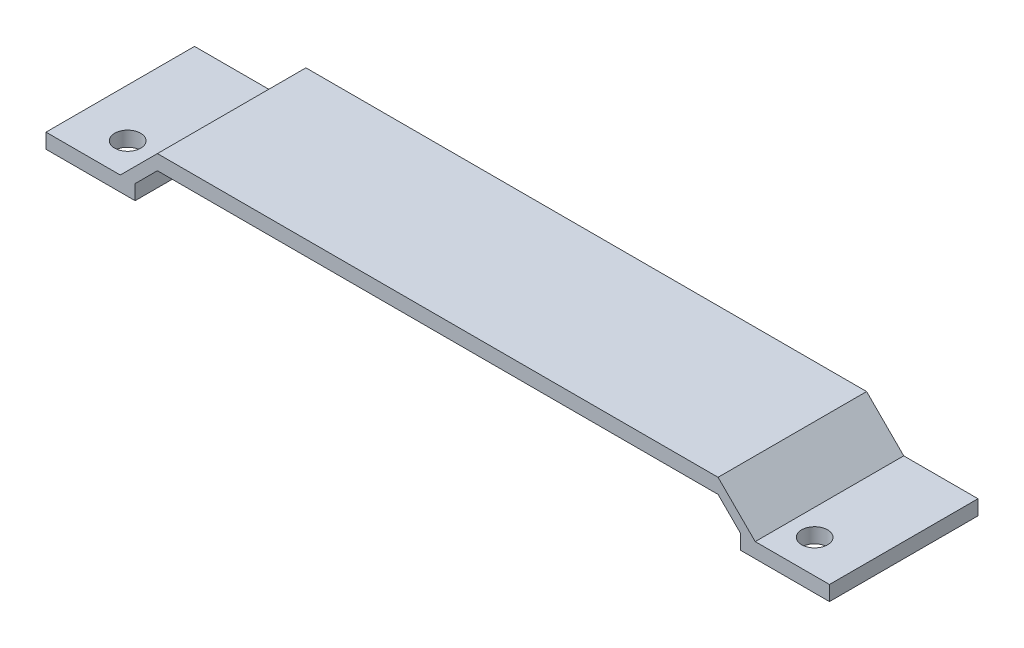
ISO-10303-21;
HEADER;
FILE_DESCRIPTION(('STEP AP214'),'2;1');
FILE_NAME('part.step','',(''),(''),'','','');
FILE_SCHEMA(('AUTOMOTIVE_DESIGN { 1 0 10303 214 1 1 1 1 }'));
ENDSEC;
DATA;
#1=APPLICATION_CONTEXT('core data for automotive mechanical design processes');
#2=APPLICATION_PROTOCOL_DEFINITION('international standard','automotive_design',2000,#1);
#3=PRODUCT_CONTEXT('',#1,'mechanical');
#4=PRODUCT('Part','Part','',(#3));
#5=PRODUCT_RELATED_PRODUCT_CATEGORY('part','',(#4));
#6=PRODUCT_DEFINITION_FORMATION('','',#4);
#7=PRODUCT_DEFINITION_CONTEXT('part definition',#1,'design');
#8=PRODUCT_DEFINITION('design','',#6,#7);
#9=PRODUCT_DEFINITION_SHAPE('','',#8);
#10=(LENGTH_UNIT() NAMED_UNIT(*) SI_UNIT(.MILLI.,.METRE.));
#11=(NAMED_UNIT(*) PLANE_ANGLE_UNIT() SI_UNIT($,.RADIAN.));
#12=(NAMED_UNIT(*) SI_UNIT($,.STERADIAN.) SOLID_ANGLE_UNIT());
#13=UNCERTAINTY_MEASURE_WITH_UNIT(LENGTH_MEASURE(1.E-05),#10,'distance_accuracy_value','');
#14=(GEOMETRIC_REPRESENTATION_CONTEXT(3) GLOBAL_UNCERTAINTY_ASSIGNED_CONTEXT((#13)) GLOBAL_UNIT_ASSIGNED_CONTEXT((#10,
#11,#12)) REPRESENTATION_CONTEXT('',''));
#15=CARTESIAN_POINT('',(0.,0.,0.));
#16=DIRECTION('',(0.,0.,1.));
#17=DIRECTION('',(1.,0.,0.));
#18=AXIS2_PLACEMENT_3D('',#15,#16,#17);
#19=CARTESIAN_POINT('',(0.,-5.00000000000003,20.));
#20=DIRECTION('',(0.,-1.,0.));
#21=DIRECTION('',(1.,0.,0.));
#22=AXIS2_PLACEMENT_3D('',#19,#20,#21);
#23=PLANE('',#22);
#24=CARTESIAN_POINT('',(-46.25,-5.00000000000001,15.5));
#25=DIRECTION('',(0.,1.,0.));
#26=DIRECTION('',(0.,0.,1.));
#27=AXIS2_PLACEMENT_3D('',#24,#25,#26);
#28=CIRCLE('',#27,1.75);
#29=CARTESIAN_POINT('',(-46.25,-5.00000000000001,17.25));
#30=VERTEX_POINT('',#29);
#31=EDGE_CURVE('E262',#30,#30,#28,.T.);
#32=ORIENTED_EDGE('',*,*,#31,.T.);
#33=EDGE_LOOP('',(#32));
#34=FACE_BOUND('',#33,.T.);
#35=DIRECTION('',(-1.,0.,0.));
#36=VECTOR('',#35,1.);
#37=CARTESIAN_POINT('',(0.,-5.00000000000003,0.));
#38=LINE('',#37,#36);
#39=CARTESIAN_POINT('',(-40.75,-5.00000000000001,0.));
#40=VERTEX_POINT('',#39);
#41=CARTESIAN_POINT('',(-52.75,-5.00000000000001,0.));
#42=VERTEX_POINT('',#41);
#43=EDGE_CURVE('E177',#40,#42,#38,.T.);
#44=ORIENTED_EDGE('',*,*,#43,.F.);
#45=DIRECTION('',(0.,0.,-1.));
#46=VECTOR('',#45,1.);
#47=CARTESIAN_POINT('',(-40.75,-5.00000000000001,20.));
#48=LINE('',#47,#46);
#49=CARTESIAN_POINT('',(-40.75,-5.00000000000001,20.));
#50=VERTEX_POINT('',#49);
#51=EDGE_CURVE('E11',#50,#40,#48,.T.);
#52=ORIENTED_EDGE('',*,*,#51,.F.);
#53=DIRECTION('',(-1.,0.,0.));
#54=VECTOR('',#53,1.);
#55=CARTESIAN_POINT('',(0.,-5.00000000000003,20.));
#56=LINE('',#55,#54);
#57=CARTESIAN_POINT('',(-52.75,-5.00000000000001,20.));
#58=VERTEX_POINT('',#57);
#59=EDGE_CURVE('E226',#50,#58,#56,.T.);
#60=ORIENTED_EDGE('',*,*,#59,.T.);
#61=DIRECTION('',(0.,0.,-1.));
#62=VECTOR('',#61,1.);
#63=CARTESIAN_POINT('',(-52.75,-5.00000000000001,20.));
#64=LINE('',#63,#62);
#65=EDGE_CURVE('E113',#58,#42,#64,.T.);
#66=ORIENTED_EDGE('',*,*,#65,.T.);
#67=EDGE_LOOP('',(#44,#52,#60,#66));
#68=FACE_BOUND('',#67,.T.);
#69=ADVANCED_FACE('F41',(#34,#68),#23,.T.);
#70=CARTESIAN_POINT('',(-40.75,0.,20.));
#71=DIRECTION('',(1.,0.,0.));
#72=DIRECTION('',(0.,0.,-1.));
#73=AXIS2_PLACEMENT_3D('',#70,#71,#72);
#74=PLANE('',#73);
#75=DIRECTION('',(0.,-1.,0.));
#76=VECTOR('',#75,1.);
#77=CARTESIAN_POINT('',(-40.75,0.,0.));
#78=LINE('',#77,#76);
#79=CARTESIAN_POINT('',(-40.75,-3.00000000000002,0.));
#80=VERTEX_POINT('',#79);
#81=EDGE_CURVE('E181',#80,#40,#78,.T.);
#82=ORIENTED_EDGE('',*,*,#81,.F.);
#83=DIRECTION('',(0.,0.,-1.));
#84=VECTOR('',#83,1.);
#85=CARTESIAN_POINT('',(-40.75,-3.00000000000002,20.));
#86=LINE('',#85,#84);
#87=CARTESIAN_POINT('',(-40.75,-3.00000000000002,20.));
#88=VERTEX_POINT('',#87);
#89=EDGE_CURVE('E51',#88,#80,#86,.T.);
#90=ORIENTED_EDGE('',*,*,#89,.F.);
#91=DIRECTION('',(0.,-1.,0.));
#92=VECTOR('',#91,1.);
#93=CARTESIAN_POINT('',(-40.75,0.,20.));
#94=LINE('',#93,#92);
#95=EDGE_CURVE('E279',#88,#50,#94,.T.);
#96=ORIENTED_EDGE('',*,*,#95,.T.);
#97=ORIENTED_EDGE('',*,*,#51,.T.);
#98=EDGE_LOOP('',(#82,#90,#96,#97));
#99=FACE_BOUND('',#98,.T.);
#100=ADVANCED_FACE('F335',(#99),#74,.T.);
#101=CARTESIAN_POINT('',(-18.8750000000002,18.875,20.));
#102=DIRECTION('',(-0.707106781186551,0.707106781186544,0.));
#103=DIRECTION('',(-0.707106781186544,-0.707106781186551,0.));
#104=AXIS2_PLACEMENT_3D('',#101,#102,#103);
#105=PLANE('',#104);
#106=DIRECTION('',(0.707106781186544,0.707106781186551,0.));
#107=VECTOR('',#106,1.);
#108=CARTESIAN_POINT('',(-18.8750000000002,18.875,0.));
#109=LINE('',#108,#107);
#110=CARTESIAN_POINT('',(-37.75,0.,0.));
#111=VERTEX_POINT('',#110);
#112=EDGE_CURVE('E185',#80,#111,#109,.T.);
#113=ORIENTED_EDGE('',*,*,#112,.T.);
#114=DIRECTION('',(0.,0.,-1.));
#115=VECTOR('',#114,1.);
#116=CARTESIAN_POINT('',(-37.75,0.,20.));
#117=LINE('',#116,#115);
#118=CARTESIAN_POINT('',(-37.75,0.,20.));
#119=VERTEX_POINT('',#118);
#120=EDGE_CURVE('E255',#119,#111,#117,.T.);
#121=ORIENTED_EDGE('',*,*,#120,.F.);
#122=DIRECTION('',(0.707106781186544,0.707106781186551,0.));
#123=VECTOR('',#122,1.);
#124=CARTESIAN_POINT('',(-18.8750000000002,18.875,20.));
#125=LINE('',#124,#123);
#126=EDGE_CURVE('E283',#88,#119,#125,.T.);
#127=ORIENTED_EDGE('',*,*,#126,.F.);
#128=ORIENTED_EDGE('',*,*,#89,.T.);
#129=EDGE_LOOP('',(#113,#121,#127,#128));
#130=FACE_BOUND('',#129,.T.);
#131=ADVANCED_FACE('F339',(#130),#105,.F.);
#132=CARTESIAN_POINT('',(0.,0.,20.));
#133=DIRECTION('',(0.,-1.,0.));
#134=DIRECTION('',(1.,0.,0.));
#135=AXIS2_PLACEMENT_3D('',#132,#133,#134);
#136=PLANE('',#135);
#137=DIRECTION('',(-1.,0.,0.));
#138=VECTOR('',#137,1.);
#139=CARTESIAN_POINT('',(0.,0.,0.));
#140=LINE('',#139,#138);
#141=CARTESIAN_POINT('',(37.75,0.,0.));
#142=VERTEX_POINT('',#141);
#143=EDGE_CURVE('E189',#142,#111,#140,.T.);
#144=ORIENTED_EDGE('',*,*,#143,.F.);
#145=DIRECTION('',(0.,0.,-1.));
#146=VECTOR('',#145,1.);
#147=CARTESIAN_POINT('',(37.75,0.,20.));
#148=LINE('',#147,#146);
#149=CARTESIAN_POINT('',(37.75,0.,20.));
#150=VERTEX_POINT('',#149);
#151=EDGE_CURVE('E252',#150,#142,#148,.T.);
#152=ORIENTED_EDGE('',*,*,#151,.F.);
#153=DIRECTION('',(-1.,0.,0.));
#154=VECTOR('',#153,1.);
#155=CARTESIAN_POINT('',(0.,0.,20.));
#156=LINE('',#155,#154);
#157=EDGE_CURVE('E286',#150,#119,#156,.T.);
#158=ORIENTED_EDGE('',*,*,#157,.T.);
#159=ORIENTED_EDGE('',*,*,#120,.T.);
#160=EDGE_LOOP('',(#144,#152,#158,#159));
#161=FACE_BOUND('',#160,.T.);
#162=ADVANCED_FACE('F352',(#161),#136,.T.);
#163=CARTESIAN_POINT('',(18.8750000000003,18.875,20.));
#164=DIRECTION('',(-0.707106781186552,-0.707106781186543,0.));
#165=DIRECTION('',(0.707106781186543,-0.707106781186552,0.));
#166=AXIS2_PLACEMENT_3D('',#163,#164,#165);
#167=PLANE('',#166);
#168=DIRECTION('',(-0.707106781186543,0.707106781186552,0.));
#169=VECTOR('',#168,1.);
#170=CARTESIAN_POINT('',(18.8750000000003,18.875,0.));
#171=LINE('',#170,#169);
#172=CARTESIAN_POINT('',(40.75,-3.00000000000001,0.));
#173=VERTEX_POINT('',#172);
#174=EDGE_CURVE('E193',#173,#142,#171,.T.);
#175=ORIENTED_EDGE('',*,*,#174,.F.);
#176=DIRECTION('',(0.,0.,-1.));
#177=VECTOR('',#176,1.);
#178=CARTESIAN_POINT('',(40.75,-3.00000000000001,20.));
#179=LINE('',#178,#177);
#180=CARTESIAN_POINT('',(40.75,-3.00000000000001,20.));
#181=VERTEX_POINT('',#180);
#182=EDGE_CURVE('E249',#181,#173,#179,.T.);
#183=ORIENTED_EDGE('',*,*,#182,.F.);
#184=DIRECTION('',(-0.707106781186543,0.707106781186552,0.));
#185=VECTOR('',#184,1.);
#186=CARTESIAN_POINT('',(18.8750000000003,18.875,20.));
#187=LINE('',#186,#185);
#188=EDGE_CURVE('E290',#181,#150,#187,.T.);
#189=ORIENTED_EDGE('',*,*,#188,.T.);
#190=ORIENTED_EDGE('',*,*,#151,.T.);
#191=EDGE_LOOP('',(#175,#183,#189,#190));
#192=FACE_BOUND('',#191,.T.);
#193=ADVANCED_FACE('F355',(#192),#167,.T.);
#194=CARTESIAN_POINT('',(40.75,0.,20.));
#195=DIRECTION('',(1.,0.,0.));
#196=DIRECTION('',(0.,0.,-1.));
#197=AXIS2_PLACEMENT_3D('',#194,#195,#196);
#198=PLANE('',#197);
#199=DIRECTION('',(0.,-1.,0.));
#200=VECTOR('',#199,1.);
#201=CARTESIAN_POINT('',(40.75,0.,0.));
#202=LINE('',#201,#200);
#203=CARTESIAN_POINT('',(40.75,-5.00000000000001,0.));
#204=VERTEX_POINT('',#203);
#205=EDGE_CURVE('E197',#173,#204,#202,.T.);
#206=ORIENTED_EDGE('',*,*,#205,.T.);
#207=DIRECTION('',(0.,0.,-1.));
#208=VECTOR('',#207,1.);
#209=CARTESIAN_POINT('',(40.75,-5.00000000000001,20.));
#210=LINE('',#209,#208);
#211=CARTESIAN_POINT('',(40.75,-5.00000000000001,20.));
#212=VERTEX_POINT('',#211);
#213=EDGE_CURVE('E245',#212,#204,#210,.T.);
#214=ORIENTED_EDGE('',*,*,#213,.F.);
#215=DIRECTION('',(0.,-1.,0.));
#216=VECTOR('',#215,1.);
#217=CARTESIAN_POINT('',(40.75,0.,20.));
#218=LINE('',#217,#216);
#219=EDGE_CURVE('E294',#181,#212,#218,.T.);
#220=ORIENTED_EDGE('',*,*,#219,.F.);
#221=ORIENTED_EDGE('',*,*,#182,.T.);
#222=EDGE_LOOP('',(#206,#214,#220,#221));
#223=FACE_BOUND('',#222,.T.);
#224=ADVANCED_FACE('F361',(#223),#198,.F.);
#225=CARTESIAN_POINT('',(0.,-5.00000000000003,20.));
#226=DIRECTION('',(0.,1.,0.));
#227=DIRECTION('',(-1.,0.,0.));
#228=AXIS2_PLACEMENT_3D('',#225,#226,#227);
#229=PLANE('',#228);
#230=CARTESIAN_POINT('',(46.25,-5.00000000000001,15.5));
#231=DIRECTION('',(0.,1.,0.));
#232=DIRECTION('',(0.,0.,-1.));
#233=AXIS2_PLACEMENT_3D('',#230,#231,#232);
#234=CIRCLE('',#233,1.75);
#235=CARTESIAN_POINT('',(46.25,-5.00000000000001,17.25));
#236=VERTEX_POINT('',#235);
#237=EDGE_CURVE('E269',#236,#236,#234,.T.);
#238=ORIENTED_EDGE('',*,*,#237,.T.);
#239=EDGE_LOOP('',(#238));
#240=FACE_BOUND('',#239,.T.);
#241=DIRECTION('',(1.,0.,0.));
#242=VECTOR('',#241,1.);
#243=CARTESIAN_POINT('',(0.,-5.00000000000003,0.));
#244=LINE('',#243,#242);
#245=CARTESIAN_POINT('',(52.75,-5.00000000000001,0.));
#246=VERTEX_POINT('',#245);
#247=EDGE_CURVE('E200',#204,#246,#244,.T.);
#248=ORIENTED_EDGE('',*,*,#247,.T.);
#249=DIRECTION('',(0.,0.,-1.));
#250=VECTOR('',#249,1.);
#251=CARTESIAN_POINT('',(52.75,-5.00000000000001,20.));
#252=LINE('',#251,#250);
#253=CARTESIAN_POINT('',(52.75,-5.00000000000001,20.));
#254=VERTEX_POINT('',#253);
#255=EDGE_CURVE('E242',#254,#246,#252,.T.);
#256=ORIENTED_EDGE('',*,*,#255,.F.);
#257=DIRECTION('',(1.,0.,0.));
#258=VECTOR('',#257,1.);
#259=CARTESIAN_POINT('',(0.,-5.00000000000003,20.));
#260=LINE('',#259,#258);
#261=EDGE_CURVE('E297',#212,#254,#260,.T.);
#262=ORIENTED_EDGE('',*,*,#261,.F.);
#263=ORIENTED_EDGE('',*,*,#213,.T.);
#264=EDGE_LOOP('',(#248,#256,#262,#263));
#265=FACE_BOUND('',#264,.T.);
#266=ADVANCED_FACE('F365',(#240,#265),#229,.F.);
#267=CARTESIAN_POINT('',(52.75,0.,20.));
#268=DIRECTION('',(1.,0.,0.));
#269=DIRECTION('',(0.,0.,-1.));
#270=AXIS2_PLACEMENT_3D('',#267,#268,#269);
#271=PLANE('',#270);
#272=DIRECTION('',(0.,-1.,0.));
#273=VECTOR('',#272,1.);
#274=CARTESIAN_POINT('',(52.75,0.,0.));
#275=LINE('',#274,#273);
#276=CARTESIAN_POINT('',(52.75,-3.00000000000001,0.));
#277=VERTEX_POINT('',#276);
#278=EDGE_CURVE('E204',#277,#246,#275,.T.);
#279=ORIENTED_EDGE('',*,*,#278,.F.);
#280=DIRECTION('',(0.,0.,-1.));
#281=VECTOR('',#280,1.);
#282=CARTESIAN_POINT('',(52.75,-3.00000000000001,20.));
#283=LINE('',#282,#281);
#284=CARTESIAN_POINT('',(52.75,-3.00000000000001,20.));
#285=VERTEX_POINT('',#284);
#286=EDGE_CURVE('E239',#285,#277,#283,.T.);
#287=ORIENTED_EDGE('',*,*,#286,.F.);
#288=DIRECTION('',(0.,-1.,0.));
#289=VECTOR('',#288,1.);
#290=CARTESIAN_POINT('',(52.75,0.,20.));
#291=LINE('',#290,#289);
#292=EDGE_CURVE('E300',#285,#254,#291,.T.);
#293=ORIENTED_EDGE('',*,*,#292,.T.);
#294=ORIENTED_EDGE('',*,*,#255,.T.);
#295=EDGE_LOOP('',(#279,#287,#293,#294));
#296=FACE_BOUND('',#295,.T.);
#297=ADVANCED_FACE('F367',(#296),#271,.T.);
#298=CARTESIAN_POINT('',(0.,-3.00000000000003,20.));
#299=DIRECTION('',(0.,1.,0.));
#300=DIRECTION('',(-1.,0.,0.));
#301=AXIS2_PLACEMENT_3D('',#298,#299,#300);
#302=PLANE('',#301);
#303=CARTESIAN_POINT('',(46.25,-3.00000000000001,15.5));
#304=DIRECTION('',(0.,1.,0.));
#305=DIRECTION('',(-1.,0.,0.));
#306=AXIS2_PLACEMENT_3D('',#303,#304,#305);
#307=CIRCLE('',#306,1.75);
#308=CARTESIAN_POINT('',(46.25,-3.00000000000001,17.25));
#309=VERTEX_POINT('',#308);
#310=EDGE_CURVE('E44',#309,#309,#307,.T.);
#311=ORIENTED_EDGE('',*,*,#310,.F.);
#312=EDGE_LOOP('',(#311));
#313=FACE_BOUND('',#312,.T.);
#314=DIRECTION('',(1.,0.,0.));
#315=VECTOR('',#314,1.);
#316=CARTESIAN_POINT('',(0.,-3.00000000000003,0.));
#317=LINE('',#316,#315);
#318=CARTESIAN_POINT('',(42.75,-3.00000000000001,0.));
#319=VERTEX_POINT('',#318);
#320=EDGE_CURVE('E208',#319,#277,#317,.T.);
#321=ORIENTED_EDGE('',*,*,#320,.F.);
#322=DIRECTION('',(0.,0.,-1.));
#323=VECTOR('',#322,1.);
#324=CARTESIAN_POINT('',(42.75,-3.00000000000001,20.));
#325=LINE('',#324,#323);
#326=CARTESIAN_POINT('',(42.75,-3.00000000000001,20.));
#327=VERTEX_POINT('',#326);
#328=EDGE_CURVE('E236',#327,#319,#325,.T.);
#329=ORIENTED_EDGE('',*,*,#328,.F.);
#330=DIRECTION('',(1.,0.,0.));
#331=VECTOR('',#330,1.);
#332=CARTESIAN_POINT('',(0.,-3.00000000000003,20.));
#333=LINE('',#332,#331);
#334=EDGE_CURVE('E304',#327,#285,#333,.T.);
#335=ORIENTED_EDGE('',*,*,#334,.T.);
#336=ORIENTED_EDGE('',*,*,#286,.T.);
#337=EDGE_LOOP('',(#321,#329,#335,#336));
#338=FACE_BOUND('',#337,.T.);
#339=ADVANCED_FACE('F319',(#313,#338),#302,.T.);
#340=CARTESIAN_POINT('',(19.8750000000002,19.875,20.));
#341=DIRECTION('',(0.707106781186552,0.707106781186543,0.));
#342=DIRECTION('',(-0.707106781186543,0.707106781186552,0.));
#343=AXIS2_PLACEMENT_3D('',#340,#341,#342);
#344=PLANE('',#343);
#345=DIRECTION('',(0.707106781186543,-0.707106781186552,0.));
#346=VECTOR('',#345,1.);
#347=CARTESIAN_POINT('',(19.8750000000002,19.875,0.));
#348=LINE('',#347,#346);
#349=CARTESIAN_POINT('',(37.75,1.99999999999999,0.));
#350=VERTEX_POINT('',#349);
#351=EDGE_CURVE('E212',#350,#319,#348,.T.);
#352=ORIENTED_EDGE('',*,*,#351,.F.);
#353=DIRECTION('',(0.,0.,-1.));
#354=VECTOR('',#353,1.);
#355=CARTESIAN_POINT('',(37.75,1.99999999999999,20.));
#356=LINE('',#355,#354);
#357=CARTESIAN_POINT('',(37.75,1.99999999999999,20.));
#358=VERTEX_POINT('',#357);
#359=EDGE_CURVE('E233',#358,#350,#356,.T.);
#360=ORIENTED_EDGE('',*,*,#359,.F.);
#361=DIRECTION('',(0.707106781186543,-0.707106781186552,0.));
#362=VECTOR('',#361,1.);
#363=CARTESIAN_POINT('',(19.8750000000002,19.875,20.));
#364=LINE('',#363,#362);
#365=EDGE_CURVE('E308',#358,#327,#364,.T.);
#366=ORIENTED_EDGE('',*,*,#365,.T.);
#367=ORIENTED_EDGE('',*,*,#328,.T.);
#368=EDGE_LOOP('',(#352,#360,#366,#367));
#369=FACE_BOUND('',#368,.T.);
#370=ADVANCED_FACE('F314',(#369),#344,.T.);
#371=CARTESIAN_POINT('',(0.,1.99999999999999,20.));
#372=DIRECTION('',(0.,-1.,0.));
#373=DIRECTION('',(0.,0.,-1.));
#374=AXIS2_PLACEMENT_3D('',#371,#372,#373);
#375=PLANE('',#374);
#376=DIRECTION('',(-1.,0.,0.));
#377=VECTOR('',#376,1.);
#378=CARTESIAN_POINT('',(0.,1.99999999999999,0.));
#379=LINE('',#378,#377);
#380=CARTESIAN_POINT('',(-37.75,1.99999999999999,0.));
#381=VERTEX_POINT('',#380);
#382=EDGE_CURVE('E216',#350,#381,#379,.T.);
#383=ORIENTED_EDGE('',*,*,#382,.T.);
#384=DIRECTION('',(0.,0.,-1.));
#385=VECTOR('',#384,1.);
#386=CARTESIAN_POINT('',(-37.75,1.99999999999999,20.));
#387=LINE('',#386,#385);
#388=CARTESIAN_POINT('',(-37.75,1.99999999999999,20.));
#389=VERTEX_POINT('',#388);
#390=EDGE_CURVE('E167',#389,#381,#387,.T.);
#391=ORIENTED_EDGE('',*,*,#390,.F.);
#392=DIRECTION('',(-1.,0.,0.));
#393=VECTOR('',#392,1.);
#394=CARTESIAN_POINT('',(0.,1.99999999999999,20.));
#395=LINE('',#394,#393);
#396=EDGE_CURVE('E156',#358,#389,#395,.T.);
#397=ORIENTED_EDGE('',*,*,#396,.F.);
#398=ORIENTED_EDGE('',*,*,#359,.T.);
#399=EDGE_LOOP('',(#383,#391,#397,#398));
#400=FACE_BOUND('',#399,.T.);
#401=ADVANCED_FACE('F325',(#400),#375,.F.);
#402=CARTESIAN_POINT('',(-19.8750000000002,19.875,20.));
#403=DIRECTION('',(0.707106781186551,-0.707106781186544,0.));
#404=DIRECTION('',(0.707106781186544,0.707106781186551,0.));
#405=AXIS2_PLACEMENT_3D('',#402,#403,#404);
#406=PLANE('',#405);
#407=DIRECTION('',(-0.707106781186544,-0.707106781186551,0.));
#408=VECTOR('',#407,1.);
#409=CARTESIAN_POINT('',(-19.8750000000002,19.875,0.));
#410=LINE('',#409,#408);
#411=CARTESIAN_POINT('',(-42.75,-3.00000000000001,0.));
#412=VERTEX_POINT('',#411);
#413=EDGE_CURVE('E165',#381,#412,#410,.T.);
#414=ORIENTED_EDGE('',*,*,#413,.T.);
#415=DIRECTION('',(0.,0.,-1.));
#416=VECTOR('',#415,1.);
#417=CARTESIAN_POINT('',(-42.75,-3.00000000000001,20.));
#418=LINE('',#417,#416);
#419=CARTESIAN_POINT('',(-42.75,-3.00000000000001,20.));
#420=VERTEX_POINT('',#419);
#421=EDGE_CURVE('E162',#420,#412,#418,.T.);
#422=ORIENTED_EDGE('',*,*,#421,.F.);
#423=DIRECTION('',(-0.707106781186544,-0.707106781186551,0.));
#424=VECTOR('',#423,1.);
#425=CARTESIAN_POINT('',(-19.8750000000002,19.875,20.));
#426=LINE('',#425,#424);
#427=EDGE_CURVE('E149',#389,#420,#426,.T.);
#428=ORIENTED_EDGE('',*,*,#427,.F.);
#429=ORIENTED_EDGE('',*,*,#390,.T.);
#430=EDGE_LOOP('',(#414,#422,#428,#429));
#431=FACE_BOUND('',#430,.T.);
#432=ADVANCED_FACE('F163',(#431),#406,.F.);
#433=CARTESIAN_POINT('',(0.,-3.00000000000003,20.));
#434=DIRECTION('',(0.,-1.,0.));
#435=DIRECTION('',(1.,0.,0.));
#436=AXIS2_PLACEMENT_3D('',#433,#434,#435);
#437=PLANE('',#436);
#438=CARTESIAN_POINT('',(-46.25,-3.00000000000001,15.5));
#439=DIRECTION('',(0.,-1.,0.));
#440=DIRECTION('',(1.,0.,0.));
#441=AXIS2_PLACEMENT_3D('',#438,#439,#440);
#442=CIRCLE('',#441,1.75);
#443=CARTESIAN_POINT('',(-46.25,-3.00000000000001,17.25));
#444=VERTEX_POINT('',#443);
#445=EDGE_CURVE('E259',#444,#444,#442,.T.);
#446=ORIENTED_EDGE('',*,*,#445,.T.);
#447=EDGE_LOOP('',(#446));
#448=FACE_BOUND('',#447,.T.);
#449=DIRECTION('',(-1.,0.,0.));
#450=VECTOR('',#449,1.);
#451=CARTESIAN_POINT('',(0.,-3.00000000000003,0.));
#452=LINE('',#451,#450);
#453=CARTESIAN_POINT('',(-52.75,-3.00000000000001,0.));
#454=VERTEX_POINT('',#453);
#455=EDGE_CURVE('E106',#412,#454,#452,.T.);
#456=ORIENTED_EDGE('',*,*,#455,.T.);
#457=DIRECTION('',(0.,0.,-1.));
#458=VECTOR('',#457,1.);
#459=CARTESIAN_POINT('',(-52.75,-3.00000000000001,20.));
#460=LINE('',#459,#458);
#461=CARTESIAN_POINT('',(-52.75,-3.00000000000001,20.));
#462=VERTEX_POINT('',#461);
#463=EDGE_CURVE('E168',#462,#454,#460,.T.);
#464=ORIENTED_EDGE('',*,*,#463,.F.);
#465=DIRECTION('',(-1.,0.,0.));
#466=VECTOR('',#465,1.);
#467=CARTESIAN_POINT('',(0.,-3.00000000000003,20.));
#468=LINE('',#467,#466);
#469=EDGE_CURVE('E153',#420,#462,#468,.T.);
#470=ORIENTED_EDGE('',*,*,#469,.F.);
#471=ORIENTED_EDGE('',*,*,#421,.T.);
#472=EDGE_LOOP('',(#456,#464,#470,#471));
#473=FACE_BOUND('',#472,.T.);
#474=ADVANCED_FACE('F170',(#448,#473),#437,.F.);
#475=CARTESIAN_POINT('',(-52.75,0.,20.));
#476=DIRECTION('',(1.,0.,0.));
#477=DIRECTION('',(0.,0.,-1.));
#478=AXIS2_PLACEMENT_3D('',#475,#476,#477);
#479=PLANE('',#478);
#480=DIRECTION('',(0.,-1.,0.));
#481=VECTOR('',#480,1.);
#482=CARTESIAN_POINT('',(-52.75,0.,0.));
#483=LINE('',#482,#481);
#484=EDGE_CURVE('E223',#454,#42,#483,.T.);
#485=ORIENTED_EDGE('',*,*,#484,.T.);
#486=ORIENTED_EDGE('',*,*,#65,.F.);
#487=DIRECTION('',(0.,-1.,0.));
#488=VECTOR('',#487,1.);
#489=CARTESIAN_POINT('',(-52.75,0.,20.));
#490=LINE('',#489,#488);
#491=EDGE_CURVE('E60',#462,#58,#490,.T.);
#492=ORIENTED_EDGE('',*,*,#491,.F.);
#493=ORIENTED_EDGE('',*,*,#463,.T.);
#494=EDGE_LOOP('',(#485,#486,#492,#493));
#495=FACE_BOUND('',#494,.T.);
#496=ADVANCED_FACE('F426',(#495),#479,.F.);
#497=CARTESIAN_POINT('',(0.,0.,20.));
#498=DIRECTION('',(0.,0.,1.));
#499=DIRECTION('',(1.,0.,0.));
#500=AXIS2_PLACEMENT_3D('',#497,#498,#499);
#501=PLANE('',#500);
#502=ORIENTED_EDGE('',*,*,#59,.F.);
#503=ORIENTED_EDGE('',*,*,#95,.F.);
#504=ORIENTED_EDGE('',*,*,#126,.T.);
#505=ORIENTED_EDGE('',*,*,#157,.F.);
#506=ORIENTED_EDGE('',*,*,#188,.F.);
#507=ORIENTED_EDGE('',*,*,#219,.T.);
#508=ORIENTED_EDGE('',*,*,#261,.T.);
#509=ORIENTED_EDGE('',*,*,#292,.F.);
#510=ORIENTED_EDGE('',*,*,#334,.F.);
#511=ORIENTED_EDGE('',*,*,#365,.F.);
#512=ORIENTED_EDGE('',*,*,#396,.T.);
#513=ORIENTED_EDGE('',*,*,#427,.T.);
#514=ORIENTED_EDGE('',*,*,#469,.T.);
#515=ORIENTED_EDGE('',*,*,#491,.T.);
#516=EDGE_LOOP('',(#502,#503,#504,#505,#506,#507,#508,#509,#510,#511,#512,#513,#514,#515));
#517=FACE_BOUND('',#516,.T.);
#518=ADVANCED_FACE('F151',(#517),#501,.T.);
#519=CARTESIAN_POINT('',(0.,0.,0.));
#520=DIRECTION('',(0.,0.,1.));
#521=DIRECTION('',(1.,0.,0.));
#522=AXIS2_PLACEMENT_3D('',#519,#520,#521);
#523=PLANE('',#522);
#524=ORIENTED_EDGE('',*,*,#43,.T.);
#525=ORIENTED_EDGE('',*,*,#484,.F.);
#526=ORIENTED_EDGE('',*,*,#455,.F.);
#527=ORIENTED_EDGE('',*,*,#413,.F.);
#528=ORIENTED_EDGE('',*,*,#382,.F.);
#529=ORIENTED_EDGE('',*,*,#351,.T.);
#530=ORIENTED_EDGE('',*,*,#320,.T.);
#531=ORIENTED_EDGE('',*,*,#278,.T.);
#532=ORIENTED_EDGE('',*,*,#247,.F.);
#533=ORIENTED_EDGE('',*,*,#205,.F.);
#534=ORIENTED_EDGE('',*,*,#174,.T.);
#535=ORIENTED_EDGE('',*,*,#143,.T.);
#536=ORIENTED_EDGE('',*,*,#112,.F.);
#537=ORIENTED_EDGE('',*,*,#81,.T.);
#538=EDGE_LOOP('',(#524,#525,#526,#527,#528,#529,#530,#531,#532,#533,#534,#535,#536,#537));
#539=FACE_BOUND('',#538,.T.);
#540=ADVANCED_FACE('F323',(#539),#523,.F.);
#541=CARTESIAN_POINT('',(-46.25,-5.00000000000001,15.5));
#542=DIRECTION('',(0.,1.,0.));
#543=DIRECTION('',(0.,0.,1.));
#544=AXIS2_PLACEMENT_3D('',#541,#542,#543);
#545=CYLINDRICAL_SURFACE('',#544,1.75);
#546=CARTESIAN_POINT('',(-46.25,-5.00000000000001,17.25));
#547=CARTESIAN_POINT('',(-46.25,-4.97916666666668,17.25));
#548=CARTESIAN_POINT('',(-46.25,-4.95833333333335,17.25));
#549=CARTESIAN_POINT('',(-46.25,-4.91666666666668,17.25));
#550=CARTESIAN_POINT('',(-46.25,-4.89583333333335,17.25));
#551=CARTESIAN_POINT('',(-46.25,-4.85416666666668,17.25));
#552=CARTESIAN_POINT('',(-46.25,-4.83333333333335,17.25));
#553=CARTESIAN_POINT('',(-46.25,-4.79166666666668,17.25));
#554=CARTESIAN_POINT('',(-46.25,-4.77083333333335,17.25));
#555=CARTESIAN_POINT('',(-46.25,-4.72916666666668,17.25));
#556=CARTESIAN_POINT('',(-46.25,-4.70833333333335,17.25));
#557=CARTESIAN_POINT('',(-46.25,-4.66666666666668,17.25));
#558=CARTESIAN_POINT('',(-46.25,-4.64583333333335,17.25));
#559=CARTESIAN_POINT('',(-46.25,-4.60416666666668,17.25));
#560=CARTESIAN_POINT('',(-46.25,-4.58333333333335,17.25));
#561=CARTESIAN_POINT('',(-46.25,-4.54166666666668,17.25));
#562=CARTESIAN_POINT('',(-46.25,-4.52083333333335,17.25));
#563=CARTESIAN_POINT('',(-46.25,-4.47916666666668,17.25));
#564=CARTESIAN_POINT('',(-46.25,-4.45833333333335,17.25));
#565=CARTESIAN_POINT('',(-46.25,-4.41666666666668,17.25));
#566=CARTESIAN_POINT('',(-46.25,-4.39583333333335,17.25));
#567=CARTESIAN_POINT('',(-46.25,-4.35416666666668,17.25));
#568=CARTESIAN_POINT('',(-46.25,-4.33333333333335,17.25));
#569=CARTESIAN_POINT('',(-46.25,-4.29166666666668,17.25));
#570=CARTESIAN_POINT('',(-46.25,-4.27083333333335,17.25));
#571=CARTESIAN_POINT('',(-46.25,-4.22916666666668,17.25));
#572=CARTESIAN_POINT('',(-46.25,-4.20833333333335,17.25));
#573=CARTESIAN_POINT('',(-46.25,-4.16666666666668,17.25));
#574=CARTESIAN_POINT('',(-46.25,-4.14583333333335,17.25));
#575=CARTESIAN_POINT('',(-46.25,-4.10416666666668,17.25));
#576=CARTESIAN_POINT('',(-46.25,-4.08333333333335,17.25));
#577=CARTESIAN_POINT('',(-46.25,-4.04166666666668,17.25));
#578=CARTESIAN_POINT('',(-46.25,-4.02083333333335,17.25));
#579=CARTESIAN_POINT('',(-46.25,-3.97916666666668,17.25));
#580=CARTESIAN_POINT('',(-46.25,-3.95833333333335,17.25));
#581=CARTESIAN_POINT('',(-46.25,-3.91666666666668,17.25));
#582=CARTESIAN_POINT('',(-46.25,-3.89583333333335,17.25));
#583=CARTESIAN_POINT('',(-46.25,-3.85416666666668,17.25));
#584=CARTESIAN_POINT('',(-46.25,-3.83333333333335,17.25));
#585=CARTESIAN_POINT('',(-46.25,-3.79166666666668,17.25));
#586=CARTESIAN_POINT('',(-46.25,-3.77083333333335,17.25));
#587=CARTESIAN_POINT('',(-46.25,-3.72916666666668,17.25));
#588=CARTESIAN_POINT('',(-46.25,-3.70833333333335,17.25));
#589=CARTESIAN_POINT('',(-46.25,-3.66666666666668,17.25));
#590=CARTESIAN_POINT('',(-46.25,-3.64583333333335,17.25));
#591=CARTESIAN_POINT('',(-46.25,-3.60416666666668,17.25));
#592=CARTESIAN_POINT('',(-46.25,-3.58333333333335,17.25));
#593=CARTESIAN_POINT('',(-46.25,-3.54166666666668,17.25));
#594=CARTESIAN_POINT('',(-46.25,-3.52083333333335,17.25));
#595=CARTESIAN_POINT('',(-46.25,-3.47916666666668,17.25));
#596=CARTESIAN_POINT('',(-46.25,-3.45833333333335,17.25));
#597=CARTESIAN_POINT('',(-46.25,-3.41666666666668,17.25));
#598=CARTESIAN_POINT('',(-46.25,-3.39583333333335,17.25));
#599=CARTESIAN_POINT('',(-46.25,-3.35416666666668,17.25));
#600=CARTESIAN_POINT('',(-46.25,-3.33333333333335,17.25));
#601=CARTESIAN_POINT('',(-46.25,-3.29166666666668,17.25));
#602=CARTESIAN_POINT('',(-46.25,-3.27083333333335,17.25));
#603=CARTESIAN_POINT('',(-46.25,-3.22916666666668,17.25));
#604=CARTESIAN_POINT('',(-46.25,-3.20833333333335,17.25));
#605=CARTESIAN_POINT('',(-46.25,-3.16666666666668,17.25));
#606=CARTESIAN_POINT('',(-46.25,-3.14583333333335,17.25));
#607=CARTESIAN_POINT('',(-46.25,-3.10416666666668,17.25));
#608=CARTESIAN_POINT('',(-46.25,-3.08333333333335,17.25));
#609=CARTESIAN_POINT('',(-46.25,-3.04166666666668,17.25));
#610=CARTESIAN_POINT('',(-46.25,-3.02083333333335,17.25));
#611=CARTESIAN_POINT('',(-46.25,-3.00000000000001,17.25));
#612=B_SPLINE_CURVE_WITH_KNOTS('',3,(#546,#547,#548,#549,#550,#551,#552,#553,#554,#555,#556,
#557,#558,#559,#560,#561,#562,#563,#564,#565,#566,#567,#568,#569,#570,#571,#572,#573,#574,#575,
#576,#577,#578,#579,#580,#581,#582,#583,#584,#585,#586,#587,#588,#589,#590,#591,#592,#593,#594,
#595,#596,#597,#598,#599,#600,#601,#602,#603,#604,#605,#606,#607,#608,#609,#610,#611),
.UNSPECIFIED.,.F.,.F.,(4,2,2,2,2,2,2,2,2,2,2,2,2,2,2,2,2,2,2,2,2,2,2,2,2,2,2,2,2,2,2,2,4),(0.,
0.0625000000000001,0.125,0.1875,0.25,0.3125,0.375,0.4375,0.5,0.5625,0.625000000000001,
0.687500000000001,0.750000000000001,0.812500000000001,0.875000000000001,0.937500000000001,1.,
1.0625,1.125,1.1875,1.25,1.3125,1.375,1.4375,1.5,1.5625,1.625,1.6875,1.75,1.8125,1.875,1.9375,
2.),.UNSPECIFIED.);
#613=EDGE_CURVE('BSEAM434',#30,#444,#612,.T.);
#614=ORIENTED_EDGE('',*,*,#31,.F.);
#615=ORIENTED_EDGE('',*,*,#445,.F.);
#616=ORIENTED_EDGE('',*,*,#613,.T.);
#617=ORIENTED_EDGE('',*,*,#613,.F.);
#618=EDGE_LOOP('',(#614,#616,#615,#617));
#619=FACE_BOUND('',#618,.T.);
#620=ADVANCED_FACE('F434',(#619),#545,.F.);
#621=CARTESIAN_POINT('',(46.25,-5.00000000000001,15.5));
#622=DIRECTION('',(0.,1.,0.));
#623=DIRECTION('',(0.,0.,1.));
#624=AXIS2_PLACEMENT_3D('',#621,#622,#623);
#625=CYLINDRICAL_SURFACE('',#624,1.75);
#626=CARTESIAN_POINT('',(46.25,-3.00000000000001,17.25));
#627=CARTESIAN_POINT('',(46.25,-3.02083333333335,17.25));
#628=CARTESIAN_POINT('',(46.25,-3.04166666666668,17.25));
#629=CARTESIAN_POINT('',(46.25,-3.08333333333335,17.25));
#630=CARTESIAN_POINT('',(46.25,-3.10416666666668,17.25));
#631=CARTESIAN_POINT('',(46.25,-3.14583333333335,17.25));
#632=CARTESIAN_POINT('',(46.25,-3.16666666666668,17.25));
#633=CARTESIAN_POINT('',(46.25,-3.20833333333335,17.25));
#634=CARTESIAN_POINT('',(46.25,-3.22916666666668,17.25));
#635=CARTESIAN_POINT('',(46.25,-3.27083333333335,17.25));
#636=CARTESIAN_POINT('',(46.25,-3.29166666666668,17.25));
#637=CARTESIAN_POINT('',(46.25,-3.33333333333335,17.25));
#638=CARTESIAN_POINT('',(46.25,-3.35416666666668,17.25));
#639=CARTESIAN_POINT('',(46.25,-3.39583333333335,17.25));
#640=CARTESIAN_POINT('',(46.25,-3.41666666666668,17.25));
#641=CARTESIAN_POINT('',(46.25,-3.45833333333335,17.25));
#642=CARTESIAN_POINT('',(46.25,-3.47916666666668,17.25));
#643=CARTESIAN_POINT('',(46.25,-3.52083333333335,17.25));
#644=CARTESIAN_POINT('',(46.25,-3.54166666666668,17.25));
#645=CARTESIAN_POINT('',(46.25,-3.58333333333335,17.25));
#646=CARTESIAN_POINT('',(46.25,-3.60416666666668,17.25));
#647=CARTESIAN_POINT('',(46.25,-3.64583333333335,17.25));
#648=CARTESIAN_POINT('',(46.25,-3.66666666666668,17.25));
#649=CARTESIAN_POINT('',(46.25,-3.70833333333335,17.25));
#650=CARTESIAN_POINT('',(46.25,-3.72916666666668,17.25));
#651=CARTESIAN_POINT('',(46.25,-3.77083333333335,17.25));
#652=CARTESIAN_POINT('',(46.25,-3.79166666666668,17.25));
#653=CARTESIAN_POINT('',(46.25,-3.83333333333335,17.25));
#654=CARTESIAN_POINT('',(46.25,-3.85416666666668,17.25));
#655=CARTESIAN_POINT('',(46.25,-3.89583333333335,17.25));
#656=CARTESIAN_POINT('',(46.25,-3.91666666666668,17.25));
#657=CARTESIAN_POINT('',(46.25,-3.95833333333335,17.25));
#658=CARTESIAN_POINT('',(46.25,-3.97916666666668,17.25));
#659=CARTESIAN_POINT('',(46.25,-4.02083333333335,17.25));
#660=CARTESIAN_POINT('',(46.25,-4.04166666666668,17.25));
#661=CARTESIAN_POINT('',(46.25,-4.08333333333335,17.25));
#662=CARTESIAN_POINT('',(46.25,-4.10416666666668,17.25));
#663=CARTESIAN_POINT('',(46.25,-4.14583333333335,17.25));
#664=CARTESIAN_POINT('',(46.25,-4.16666666666668,17.25));
#665=CARTESIAN_POINT('',(46.25,-4.20833333333335,17.25));
#666=CARTESIAN_POINT('',(46.25,-4.22916666666668,17.25));
#667=CARTESIAN_POINT('',(46.25,-4.27083333333335,17.25));
#668=CARTESIAN_POINT('',(46.25,-4.29166666666668,17.25));
#669=CARTESIAN_POINT('',(46.25,-4.33333333333335,17.25));
#670=CARTESIAN_POINT('',(46.25,-4.35416666666668,17.25));
#671=CARTESIAN_POINT('',(46.25,-4.39583333333335,17.25));
#672=CARTESIAN_POINT('',(46.25,-4.41666666666668,17.25));
#673=CARTESIAN_POINT('',(46.25,-4.45833333333335,17.25));
#674=CARTESIAN_POINT('',(46.25,-4.47916666666668,17.25));
#675=CARTESIAN_POINT('',(46.25,-4.52083333333335,17.25));
#676=CARTESIAN_POINT('',(46.25,-4.54166666666668,17.25));
#677=CARTESIAN_POINT('',(46.25,-4.58333333333335,17.25));
#678=CARTESIAN_POINT('',(46.25,-4.60416666666668,17.25));
#679=CARTESIAN_POINT('',(46.25,-4.64583333333335,17.25));
#680=CARTESIAN_POINT('',(46.25,-4.66666666666668,17.25));
#681=CARTESIAN_POINT('',(46.25,-4.70833333333335,17.25));
#682=CARTESIAN_POINT('',(46.25,-4.72916666666668,17.25));
#683=CARTESIAN_POINT('',(46.25,-4.77083333333335,17.25));
#684=CARTESIAN_POINT('',(46.25,-4.79166666666668,17.25));
#685=CARTESIAN_POINT('',(46.25,-4.83333333333335,17.25));
#686=CARTESIAN_POINT('',(46.25,-4.85416666666668,17.25));
#687=CARTESIAN_POINT('',(46.25,-4.89583333333335,17.25));
#688=CARTESIAN_POINT('',(46.25,-4.91666666666668,17.25));
#689=CARTESIAN_POINT('',(46.25,-4.95833333333335,17.25));
#690=CARTESIAN_POINT('',(46.25,-4.97916666666668,17.25));
#691=CARTESIAN_POINT('',(46.25,-5.00000000000001,17.25));
#692=B_SPLINE_CURVE_WITH_KNOTS('',3,(#626,#627,#628,#629,#630,#631,#632,#633,#634,#635,#636,
#637,#638,#639,#640,#641,#642,#643,#644,#645,#646,#647,#648,#649,#650,#651,#652,#653,#654,#655,
#656,#657,#658,#659,#660,#661,#662,#663,#664,#665,#666,#667,#668,#669,#670,#671,#672,#673,#674,
#675,#676,#677,#678,#679,#680,#681,#682,#683,#684,#685,#686,#687,#688,#689,#690,#691),
.UNSPECIFIED.,.F.,.F.,(4,2,2,2,2,2,2,2,2,2,2,2,2,2,2,2,2,2,2,2,2,2,2,2,2,2,2,2,2,2,2,2,4),(0.,
0.0624999999999996,0.125,0.1875,0.25,0.3125,0.375,0.4375,0.5,0.5625,0.625,0.6875,0.75,0.8125,
0.875,0.9375,1.,1.0625,1.125,1.1875,1.25,1.3125,1.375,1.4375,1.5,1.5625,1.625,1.6875,1.75,
1.8125,1.875,1.9375,2.),.UNSPECIFIED.);
#693=EDGE_CURVE('BSEAM439',#309,#236,#692,.T.);
#694=ORIENTED_EDGE('',*,*,#310,.T.);
#695=ORIENTED_EDGE('',*,*,#237,.F.);
#696=ORIENTED_EDGE('',*,*,#693,.T.);
#697=ORIENTED_EDGE('',*,*,#693,.F.);
#698=EDGE_LOOP('',(#694,#696,#695,#697));
#699=FACE_BOUND('',#698,.T.);
#700=ADVANCED_FACE('F439',(#699),#625,.F.);
#701=CLOSED_SHELL('',(#69,#100,#131,#162,#193,#224,#266,#297,#339,#370,#401,#432,#474,#496,#518,
#540,#620,#700));
#702=MANIFOLD_SOLID_BREP('B2',#701);
#703=ADVANCED_BREP_SHAPE_REPRESENTATION('',(#18,#702),#14);
#704=SHAPE_DEFINITION_REPRESENTATION(#9,#703);
ENDSEC;
END-ISO-10303-21;
